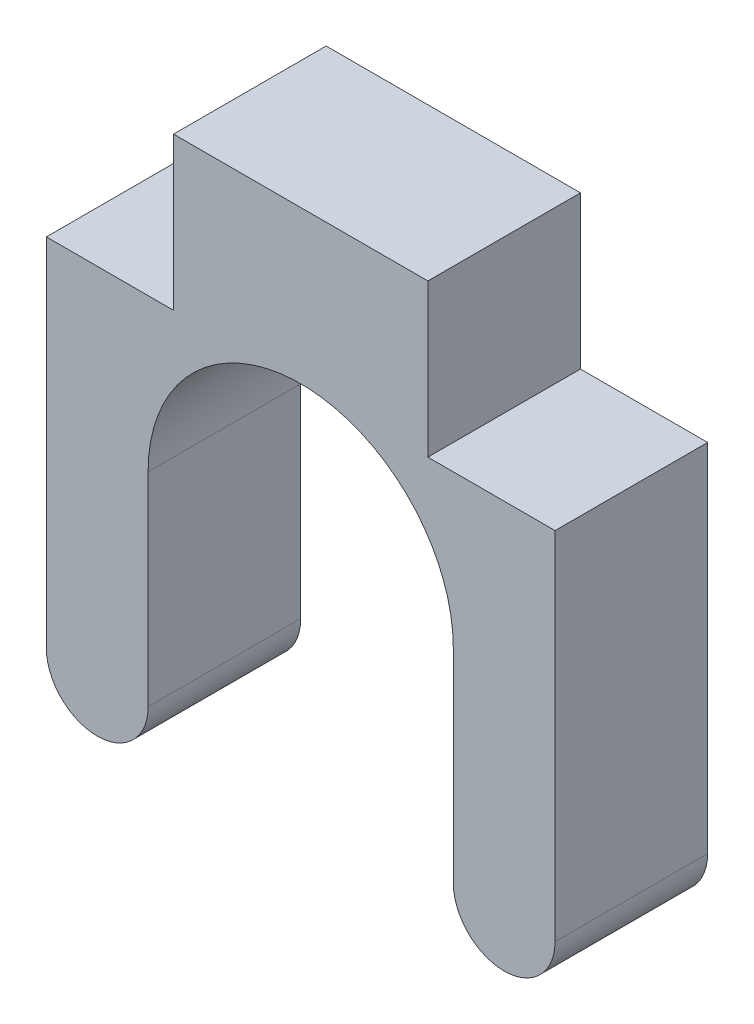
ISO-10303-21;
HEADER;
FILE_DESCRIPTION(('STEP AP214'),'2;1');
FILE_NAME('part.step','',(''),(''),'','','');
FILE_SCHEMA(('AUTOMOTIVE_DESIGN { 1 0 10303 214 1 1 1 1 }'));
ENDSEC;
DATA;
#1=APPLICATION_CONTEXT('core data for automotive mechanical design processes');
#2=APPLICATION_PROTOCOL_DEFINITION('international standard','automotive_design',2000,#1);
#3=PRODUCT_CONTEXT('',#1,'mechanical');
#4=PRODUCT('Part','Part','',(#3));
#5=PRODUCT_RELATED_PRODUCT_CATEGORY('part','',(#4));
#6=PRODUCT_DEFINITION_FORMATION('','',#4);
#7=PRODUCT_DEFINITION_CONTEXT('part definition',#1,'design');
#8=PRODUCT_DEFINITION('design','',#6,#7);
#9=PRODUCT_DEFINITION_SHAPE('','',#8);
#10=(LENGTH_UNIT() NAMED_UNIT(*) SI_UNIT(.MILLI.,.METRE.));
#11=(NAMED_UNIT(*) PLANE_ANGLE_UNIT() SI_UNIT($,.RADIAN.));
#12=(NAMED_UNIT(*) SI_UNIT($,.STERADIAN.) SOLID_ANGLE_UNIT());
#13=UNCERTAINTY_MEASURE_WITH_UNIT(LENGTH_MEASURE(1.E-05),#10,'distance_accuracy_value','');
#14=(GEOMETRIC_REPRESENTATION_CONTEXT(3) GLOBAL_UNCERTAINTY_ASSIGNED_CONTEXT((#13)) GLOBAL_UNIT_ASSIGNED_CONTEXT((#10,
#11,#12)) REPRESENTATION_CONTEXT('',''));
#15=CARTESIAN_POINT('',(0.,0.,0.));
#16=DIRECTION('',(0.,0.,1.));
#17=DIRECTION('',(1.,0.,0.));
#18=AXIS2_PLACEMENT_3D('',#15,#16,#17);
#19=CARTESIAN_POINT('',(0.,15.,0.));
#20=DIRECTION('',(0.,1.,0.));
#21=DIRECTION('',(0.,0.,1.));
#22=AXIS2_PLACEMENT_3D('',#19,#20,#21);
#23=PLANE('',#22);
#24=DIRECTION('',(-1.,0.,0.));
#25=VECTOR('',#24,1.);
#26=CARTESIAN_POINT('',(-450.,15.,-300.));
#27=LINE('',#26,#25);
#28=CARTESIAN_POINT('',(-412.5,15.,-300.));
#29=VERTEX_POINT('',#28);
#30=CARTESIAN_POINT('',(-437.5,15.,-300.));
#31=VERTEX_POINT('',#30);
#32=EDGE_CURVE('E216',#29,#31,#27,.T.);
#33=ORIENTED_EDGE('',*,*,#32,.T.);
#34=DIRECTION('',(0.,0.,1.));
#35=VECTOR('',#34,1.);
#36=CARTESIAN_POINT('',(-437.5,15.,-300.));
#37=LINE('',#36,#35);
#38=CARTESIAN_POINT('',(-437.5,15.,-285.));
#39=VERTEX_POINT('',#38);
#40=EDGE_CURVE('E198',#31,#39,#37,.T.);
#41=ORIENTED_EDGE('',*,*,#40,.T.);
#42=DIRECTION('',(-1.,0.,0.));
#43=VECTOR('',#42,1.);
#44=CARTESIAN_POINT('',(0.,15.,-285.));
#45=LINE('',#44,#43);
#46=CARTESIAN_POINT('',(-412.5,15.,-285.));
#47=VERTEX_POINT('',#46);
#48=EDGE_CURVE('E265',#47,#39,#45,.T.);
#49=ORIENTED_EDGE('',*,*,#48,.F.);
#50=DIRECTION('',(0.,0.,1.));
#51=VECTOR('',#50,1.);
#52=CARTESIAN_POINT('',(-412.5,15.,-300.));
#53=LINE('',#52,#51);
#54=EDGE_CURVE('E120',#29,#47,#53,.T.);
#55=ORIENTED_EDGE('',*,*,#54,.F.);
#56=EDGE_LOOP('',(#33,#41,#49,#55));
#57=FACE_BOUND('',#56,.T.);
#58=ADVANCED_FACE('F95',(#57),#23,.T.);
#59=CARTESIAN_POINT('',(-400.,5.55111512312578E-13,347.169905660283));
#60=DIRECTION('',(-1.,0.,0.));
#61=DIRECTION('',(0.,-1.,0.));
#62=AXIS2_PLACEMENT_3D('',#59,#60,#61);
#63=PLANE('',#62);
#64=DIRECTION('',(0.,0.,1.));
#65=VECTOR('',#64,1.);
#66=CARTESIAN_POINT('',(-400.,0.,-300.));
#67=LINE('',#66,#65);
#68=CARTESIAN_POINT('',(-400.,0.,-300.));
#69=VERTEX_POINT('',#68);
#70=CARTESIAN_POINT('',(-400.,0.,-285.));
#71=VERTEX_POINT('',#70);
#72=EDGE_CURVE('E319',#69,#71,#67,.T.);
#73=ORIENTED_EDGE('',*,*,#72,.T.);
#74=DIRECTION('',(0.,-1.,0.));
#75=VECTOR('',#74,1.);
#76=CARTESIAN_POINT('',(-400.,5.55111512312578E-13,-285.));
#77=LINE('',#76,#75);
#78=CARTESIAN_POINT('',(-400.,-35.,-285.));
#79=VERTEX_POINT('',#78);
#80=EDGE_CURVE('E283',#71,#79,#77,.T.);
#81=ORIENTED_EDGE('',*,*,#80,.T.);
#82=DIRECTION('',(0.,0.,-1.));
#83=VECTOR('',#82,1.);
#84=CARTESIAN_POINT('',(-400.,-35.,347.169905660283));
#85=LINE('',#84,#83);
#86=CARTESIAN_POINT('',(-400.,-35.,-300.));
#87=VERTEX_POINT('',#86);
#88=EDGE_CURVE('E247',#79,#87,#85,.T.);
#89=ORIENTED_EDGE('',*,*,#88,.T.);
#90=DIRECTION('',(0.,-1.,0.));
#91=VECTOR('',#90,1.);
#92=CARTESIAN_POINT('',(-400.,15.,-300.));
#93=LINE('',#92,#91);
#94=EDGE_CURVE('E223',#69,#87,#93,.T.);
#95=ORIENTED_EDGE('',*,*,#94,.F.);
#96=EDGE_LOOP('',(#73,#81,#89,#95));
#97=FACE_BOUND('',#96,.T.);
#98=ADVANCED_FACE('F343',(#97),#63,.F.);
#99=CARTESIAN_POINT('',(-450.,15.,-300.));
#100=DIRECTION('',(0.,0.,1.));
#101=DIRECTION('',(1.,0.,0.));
#102=AXIS2_PLACEMENT_3D('',#99,#100,#101);
#103=PLANE('',#102);
#104=DIRECTION('',(0.,-1.,0.));
#105=VECTOR('',#104,1.);
#106=CARTESIAN_POINT('',(-437.5,0.,-300.));
#107=LINE('',#106,#105);
#108=CARTESIAN_POINT('',(-437.5,0.,-300.));
#109=VERTEX_POINT('',#108);
#110=EDGE_CURVE('E201',#31,#109,#107,.T.);
#111=ORIENTED_EDGE('',*,*,#110,.F.);
#112=ORIENTED_EDGE('',*,*,#32,.F.);
#113=DIRECTION('',(0.,-1.,0.));
#114=VECTOR('',#113,1.);
#115=CARTESIAN_POINT('',(-412.5,0.,-300.));
#116=LINE('',#115,#114);
#117=CARTESIAN_POINT('',(-412.5,0.,-300.));
#118=VERTEX_POINT('',#117);
#119=EDGE_CURVE('E324',#29,#118,#116,.T.);
#120=ORIENTED_EDGE('',*,*,#119,.T.);
#121=DIRECTION('',(-1.,0.,0.));
#122=VECTOR('',#121,1.);
#123=CARTESIAN_POINT('',(0.,0.,-300.));
#124=LINE('',#123,#122);
#125=EDGE_CURVE('E326',#69,#118,#124,.T.);
#126=ORIENTED_EDGE('',*,*,#125,.F.);
#127=ORIENTED_EDGE('',*,*,#94,.T.);
#128=CARTESIAN_POINT('',(-405.,-35.,-300.));
#129=DIRECTION('',(0.,0.,1.));
#130=DIRECTION('',(1.,0.,0.));
#131=AXIS2_PLACEMENT_3D('',#128,#129,#130);
#132=CIRCLE('',#131,5.);
#133=CARTESIAN_POINT('',(-405.,-40.,-300.));
#134=VERTEX_POINT('',#133);
#135=EDGE_CURVE('E236',#87,#134,#132,.F.);
#136=ORIENTED_EDGE('',*,*,#135,.T.);
#137=CARTESIAN_POINT('',(-405.,-35.,-300.));
#138=DIRECTION('',(0.,0.,1.));
#139=DIRECTION('',(1.,0.,0.));
#140=AXIS2_PLACEMENT_3D('',#137,#138,#139);
#141=CIRCLE('',#140,5.);
#142=CARTESIAN_POINT('',(-410.,-35.,-300.));
#143=VERTEX_POINT('',#142);
#144=EDGE_CURVE('E234',#134,#143,#141,.F.);
#145=ORIENTED_EDGE('',*,*,#144,.T.);
#146=DIRECTION('',(0.,1.,0.));
#147=VECTOR('',#146,1.);
#148=CARTESIAN_POINT('',(-410.,0.,-300.));
#149=LINE('',#148,#147);
#150=CARTESIAN_POINT('',(-410.,-15.,-300.));
#151=VERTEX_POINT('',#150);
#152=EDGE_CURVE('E226',#143,#151,#149,.T.);
#153=ORIENTED_EDGE('',*,*,#152,.T.);
#154=CARTESIAN_POINT('',(-425.,-15.,-300.));
#155=DIRECTION('',(0.,0.,1.));
#156=DIRECTION('',(1.,0.,0.));
#157=AXIS2_PLACEMENT_3D('',#154,#155,#156);
#158=CIRCLE('',#157,15.);
#159=CARTESIAN_POINT('',(-440.,-15.,-300.));
#160=VERTEX_POINT('',#159);
#161=EDGE_CURVE('E290',#160,#151,#158,.F.);
#162=ORIENTED_EDGE('',*,*,#161,.F.);
#163=DIRECTION('',(0.,1.,0.));
#164=VECTOR('',#163,1.);
#165=CARTESIAN_POINT('',(-440.,0.,-300.));
#166=LINE('',#165,#164);
#167=CARTESIAN_POINT('',(-440.,-35.,-300.));
#168=VERTEX_POINT('',#167);
#169=EDGE_CURVE('E288',#168,#160,#166,.T.);
#170=ORIENTED_EDGE('',*,*,#169,.F.);
#171=CARTESIAN_POINT('',(-445.,-35.,-300.));
#172=DIRECTION('',(0.,0.,1.));
#173=DIRECTION('',(1.,0.,0.));
#174=AXIS2_PLACEMENT_3D('',#171,#172,#173);
#175=CIRCLE('',#174,5.);
#176=CARTESIAN_POINT('',(-445.,-40.,-300.));
#177=VERTEX_POINT('',#176);
#178=EDGE_CURVE('E241',#168,#177,#175,.F.);
#179=ORIENTED_EDGE('',*,*,#178,.T.);
#180=CARTESIAN_POINT('',(-445.,-35.,-300.));
#181=DIRECTION('',(0.,0.,1.));
#182=DIRECTION('',(1.,0.,0.));
#183=AXIS2_PLACEMENT_3D('',#180,#181,#182);
#184=CIRCLE('',#183,5.);
#185=CARTESIAN_POINT('',(-450.,-35.,-300.));
#186=VERTEX_POINT('',#185);
#187=EDGE_CURVE('E238',#177,#186,#184,.F.);
#188=ORIENTED_EDGE('',*,*,#187,.T.);
#189=DIRECTION('',(0.,-1.,0.));
#190=VECTOR('',#189,1.);
#191=CARTESIAN_POINT('',(-450.,15.,-300.));
#192=LINE('',#191,#190);
#193=CARTESIAN_POINT('',(-450.,0.,-300.));
#194=VERTEX_POINT('',#193);
#195=EDGE_CURVE('E220',#194,#186,#192,.T.);
#196=ORIENTED_EDGE('',*,*,#195,.F.);
#197=DIRECTION('',(1.,0.,0.));
#198=VECTOR('',#197,1.);
#199=CARTESIAN_POINT('',(0.,0.,-300.));
#200=LINE('',#199,#198);
#201=EDGE_CURVE('E209',#194,#109,#200,.T.);
#202=ORIENTED_EDGE('',*,*,#201,.T.);
#203=EDGE_LOOP('',(#111,#112,#120,#126,#127,#136,#145,#153,#162,#170,#179,#188,#196,#202));
#204=FACE_BOUND('',#203,.T.);
#205=ADVANCED_FACE('F214',(#204),#103,.F.);
#206=CARTESIAN_POINT('',(-450.,0.,-285.));
#207=DIRECTION('',(0.,0.,-1.));
#208=DIRECTION('',(-1.,0.,0.));
#209=AXIS2_PLACEMENT_3D('',#206,#207,#208);
#210=PLANE('',#209);
#211=DIRECTION('',(0.,-1.,0.));
#212=VECTOR('',#211,1.);
#213=CARTESIAN_POINT('',(-437.5,0.,-285.));
#214=LINE('',#213,#212);
#215=CARTESIAN_POINT('',(-437.5,0.,-285.));
#216=VERTEX_POINT('',#215);
#217=EDGE_CURVE('E204',#39,#216,#214,.T.);
#218=ORIENTED_EDGE('',*,*,#217,.T.);
#219=DIRECTION('',(1.,0.,0.));
#220=VECTOR('',#219,1.);
#221=CARTESIAN_POINT('',(0.,0.,-285.));
#222=LINE('',#221,#220);
#223=CARTESIAN_POINT('',(-450.,0.,-285.));
#224=VERTEX_POINT('',#223);
#225=EDGE_CURVE('E218',#224,#216,#222,.T.);
#226=ORIENTED_EDGE('',*,*,#225,.F.);
#227=DIRECTION('',(0.,1.,0.));
#228=VECTOR('',#227,1.);
#229=CARTESIAN_POINT('',(-450.,0.,-285.));
#230=LINE('',#229,#228);
#231=CARTESIAN_POINT('',(-450.,-35.,-285.));
#232=VERTEX_POINT('',#231);
#233=EDGE_CURVE('E257',#232,#224,#230,.T.);
#234=ORIENTED_EDGE('',*,*,#233,.F.);
#235=CARTESIAN_POINT('',(-445.,-35.,-285.));
#236=DIRECTION('',(0.,0.,-1.));
#237=DIRECTION('',(-1.,0.,0.));
#238=AXIS2_PLACEMENT_3D('',#235,#236,#237);
#239=CIRCLE('',#238,5.);
#240=CARTESIAN_POINT('',(-445.,-40.,-285.));
#241=VERTEX_POINT('',#240);
#242=EDGE_CURVE('E243',#232,#241,#239,.F.);
#243=ORIENTED_EDGE('',*,*,#242,.T.);
#244=CARTESIAN_POINT('',(-445.,-35.,-285.));
#245=DIRECTION('',(0.,0.,-1.));
#246=DIRECTION('',(-1.,0.,0.));
#247=AXIS2_PLACEMENT_3D('',#244,#245,#246);
#248=CIRCLE('',#247,5.);
#249=CARTESIAN_POINT('',(-440.,-35.,-285.));
#250=VERTEX_POINT('',#249);
#251=EDGE_CURVE('E245',#241,#250,#248,.F.);
#252=ORIENTED_EDGE('',*,*,#251,.T.);
#253=DIRECTION('',(0.,1.,0.));
#254=VECTOR('',#253,1.);
#255=CARTESIAN_POINT('',(-440.,0.,-285.));
#256=LINE('',#255,#254);
#257=CARTESIAN_POINT('',(-440.,-15.,-285.));
#258=VERTEX_POINT('',#257);
#259=EDGE_CURVE('E262',#250,#258,#256,.T.);
#260=ORIENTED_EDGE('',*,*,#259,.T.);
#261=CARTESIAN_POINT('',(-425.,-15.,-285.));
#262=DIRECTION('',(0.,0.,-1.));
#263=DIRECTION('',(-1.,0.,0.));
#264=AXIS2_PLACEMENT_3D('',#261,#262,#263);
#265=CIRCLE('',#264,15.);
#266=CARTESIAN_POINT('',(-410.,-15.,-285.));
#267=VERTEX_POINT('',#266);
#268=EDGE_CURVE('E278',#258,#267,#265,.T.);
#269=ORIENTED_EDGE('',*,*,#268,.T.);
#270=DIRECTION('',(0.,1.,0.));
#271=VECTOR('',#270,1.);
#272=CARTESIAN_POINT('',(-410.,0.,-285.));
#273=LINE('',#272,#271);
#274=CARTESIAN_POINT('',(-410.,-35.,-285.));
#275=VERTEX_POINT('',#274);
#276=EDGE_CURVE('E280',#275,#267,#273,.T.);
#277=ORIENTED_EDGE('',*,*,#276,.F.);
#278=CARTESIAN_POINT('',(-405.,-35.,-285.));
#279=DIRECTION('',(0.,0.,-1.));
#280=DIRECTION('',(-1.,0.,0.));
#281=AXIS2_PLACEMENT_3D('',#278,#279,#280);
#282=CIRCLE('',#281,5.);
#283=CARTESIAN_POINT('',(-405.,-40.,-285.));
#284=VERTEX_POINT('',#283);
#285=EDGE_CURVE('E250',#275,#284,#282,.F.);
#286=ORIENTED_EDGE('',*,*,#285,.T.);
#287=CARTESIAN_POINT('',(-405.,-35.,-285.));
#288=DIRECTION('',(0.,0.,-1.));
#289=DIRECTION('',(-1.,0.,0.));
#290=AXIS2_PLACEMENT_3D('',#287,#288,#289);
#291=CIRCLE('',#290,5.);
#292=EDGE_CURVE('E252',#284,#79,#291,.F.);
#293=ORIENTED_EDGE('',*,*,#292,.T.);
#294=ORIENTED_EDGE('',*,*,#80,.F.);
#295=DIRECTION('',(-1.,0.,0.));
#296=VECTOR('',#295,1.);
#297=CARTESIAN_POINT('',(0.,0.,-285.));
#298=LINE('',#297,#296);
#299=CARTESIAN_POINT('',(-412.5,0.,-285.));
#300=VERTEX_POINT('',#299);
#301=EDGE_CURVE('E327',#71,#300,#298,.T.);
#302=ORIENTED_EDGE('',*,*,#301,.T.);
#303=DIRECTION('',(0.,-1.,0.));
#304=VECTOR('',#303,1.);
#305=CARTESIAN_POINT('',(-412.5,0.,-285.));
#306=LINE('',#305,#304);
#307=EDGE_CURVE('E329',#47,#300,#306,.T.);
#308=ORIENTED_EDGE('',*,*,#307,.F.);
#309=ORIENTED_EDGE('',*,*,#48,.T.);
#310=EDGE_LOOP('',(#218,#226,#234,#243,#252,#260,#269,#277,#286,#293,#294,#302,#308,#309));
#311=FACE_BOUND('',#310,.T.);
#312=ADVANCED_FACE('F317',(#311),#210,.F.);
#313=CARTESIAN_POINT('',(-450.,15.,-300.));
#314=DIRECTION('',(1.,0.,0.));
#315=DIRECTION('',(0.,0.,-1.));
#316=AXIS2_PLACEMENT_3D('',#313,#314,#315);
#317=PLANE('',#316);
#318=ORIENTED_EDGE('',*,*,#233,.T.);
#319=DIRECTION('',(0.,0.,1.));
#320=VECTOR('',#319,1.);
#321=CARTESIAN_POINT('',(-450.,0.,-300.));
#322=LINE('',#321,#320);
#323=EDGE_CURVE('E112',#194,#224,#322,.T.);
#324=ORIENTED_EDGE('',*,*,#323,.F.);
#325=ORIENTED_EDGE('',*,*,#195,.T.);
#326=DIRECTION('',(0.,0.,-1.));
#327=VECTOR('',#326,1.);
#328=CARTESIAN_POINT('',(-450.,-35.,-300.));
#329=LINE('',#328,#327);
#330=EDGE_CURVE('E104',#186,#232,#329,.F.);
#331=ORIENTED_EDGE('',*,*,#330,.T.);
#332=EDGE_LOOP('',(#318,#324,#325,#331));
#333=FACE_BOUND('',#332,.T.);
#334=ADVANCED_FACE('F316',(#333),#317,.F.);
#335=CARTESIAN_POINT('',(-410.,0.,347.169905660283));
#336=DIRECTION('',(1.,0.,0.));
#337=DIRECTION('',(0.,0.,-1.));
#338=AXIS2_PLACEMENT_3D('',#335,#336,#337);
#339=PLANE('',#338);
#340=ORIENTED_EDGE('',*,*,#152,.F.);
#341=DIRECTION('',(0.,0.,-1.));
#342=VECTOR('',#341,1.);
#343=CARTESIAN_POINT('',(-410.,-35.,347.169905660283));
#344=LINE('',#343,#342);
#345=EDGE_CURVE('E12',#143,#275,#344,.F.);
#346=ORIENTED_EDGE('',*,*,#345,.T.);
#347=ORIENTED_EDGE('',*,*,#276,.T.);
#348=DIRECTION('',(0.,0.,-1.));
#349=VECTOR('',#348,1.);
#350=CARTESIAN_POINT('',(-410.,-15.,347.169905660283));
#351=LINE('',#350,#349);
#352=EDGE_CURVE('E221',#267,#151,#351,.T.);
#353=ORIENTED_EDGE('',*,*,#352,.T.);
#354=EDGE_LOOP('',(#340,#346,#347,#353));
#355=FACE_BOUND('',#354,.T.);
#356=ADVANCED_FACE('F299',(#355),#339,.F.);
#357=CARTESIAN_POINT('',(-425.,-15.,347.169905660283));
#358=DIRECTION('',(0.,0.,-1.));
#359=DIRECTION('',(-1.,0.,0.));
#360=AXIS2_PLACEMENT_3D('',#357,#358,#359);
#361=CYLINDRICAL_SURFACE('',#360,15.);
#362=ORIENTED_EDGE('',*,*,#352,.F.);
#363=ORIENTED_EDGE('',*,*,#268,.F.);
#364=DIRECTION('',(0.,0.,-1.));
#365=VECTOR('',#364,1.);
#366=CARTESIAN_POINT('',(-440.,-15.,347.169905660283));
#367=LINE('',#366,#365);
#368=EDGE_CURVE('E285',#258,#160,#367,.T.);
#369=ORIENTED_EDGE('',*,*,#368,.T.);
#370=ORIENTED_EDGE('',*,*,#161,.T.);
#371=EDGE_LOOP('',(#362,#363,#369,#370));
#372=FACE_BOUND('',#371,.T.);
#373=ADVANCED_FACE('F303',(#372),#361,.F.);
#374=CARTESIAN_POINT('',(-440.,0.,347.169905660283));
#375=DIRECTION('',(1.,0.,0.));
#376=DIRECTION('',(0.,0.,-1.));
#377=AXIS2_PLACEMENT_3D('',#374,#375,#376);
#378=PLANE('',#377);
#379=ORIENTED_EDGE('',*,*,#259,.F.);
#380=DIRECTION('',(0.,0.,-1.));
#381=VECTOR('',#380,1.);
#382=CARTESIAN_POINT('',(-440.,-35.,-300.));
#383=LINE('',#382,#381);
#384=EDGE_CURVE('E231',#250,#168,#383,.T.);
#385=ORIENTED_EDGE('',*,*,#384,.T.);
#386=ORIENTED_EDGE('',*,*,#169,.T.);
#387=ORIENTED_EDGE('',*,*,#368,.F.);
#388=EDGE_LOOP('',(#379,#385,#386,#387));
#389=FACE_BOUND('',#388,.T.);
#390=ADVANCED_FACE('F307',(#389),#378,.T.);
#391=CARTESIAN_POINT('',(-445.,-35.,347.169905660283));
#392=DIRECTION('',(0.,0.,-1.));
#393=DIRECTION('',(-1.,0.,0.));
#394=AXIS2_PLACEMENT_3D('',#391,#392,#393);
#395=CYLINDRICAL_SURFACE('',#394,5.);
#396=DIRECTION('',(0.,0.,-1.));
#397=VECTOR('',#396,1.);
#398=CARTESIAN_POINT('',(-445.,-40.,347.169905660283));
#399=LINE('',#398,#397);
#400=EDGE_CURVE('E255',#241,#177,#399,.T.);
#401=ORIENTED_EDGE('',*,*,#400,.F.);
#402=ORIENTED_EDGE('',*,*,#242,.F.);
#403=ORIENTED_EDGE('',*,*,#330,.F.);
#404=ORIENTED_EDGE('',*,*,#187,.F.);
#405=EDGE_LOOP('',(#401,#402,#403,#404));
#406=FACE_BOUND('',#405,.T.);
#407=ADVANCED_FACE('F312',(#406),#395,.T.);
#408=CARTESIAN_POINT('',(-445.,-35.,347.169905660283));
#409=DIRECTION('',(0.,0.,1.));
#410=DIRECTION('',(1.,0.,0.));
#411=AXIS2_PLACEMENT_3D('',#408,#409,#410);
#412=CYLINDRICAL_SURFACE('',#411,5.);
#413=ORIENTED_EDGE('',*,*,#251,.F.);
#414=ORIENTED_EDGE('',*,*,#400,.T.);
#415=ORIENTED_EDGE('',*,*,#178,.F.);
#416=ORIENTED_EDGE('',*,*,#384,.F.);
#417=EDGE_LOOP('',(#413,#414,#415,#416));
#418=FACE_BOUND('',#417,.T.);
#419=ADVANCED_FACE('F353',(#418),#412,.T.);
#420=CARTESIAN_POINT('',(-405.,-35.,347.169905660283));
#421=DIRECTION('',(0.,0.,-1.));
#422=DIRECTION('',(-1.,0.,0.));
#423=AXIS2_PLACEMENT_3D('',#420,#421,#422);
#424=CYLINDRICAL_SURFACE('',#423,5.);
#425=DIRECTION('',(0.,0.,-1.));
#426=VECTOR('',#425,1.);
#427=CARTESIAN_POINT('',(-405.,-40.,347.169905660283));
#428=LINE('',#427,#426);
#429=EDGE_CURVE('E99',#284,#134,#428,.T.);
#430=ORIENTED_EDGE('',*,*,#429,.F.);
#431=ORIENTED_EDGE('',*,*,#285,.F.);
#432=ORIENTED_EDGE('',*,*,#345,.F.);
#433=ORIENTED_EDGE('',*,*,#144,.F.);
#434=EDGE_LOOP('',(#430,#431,#432,#433));
#435=FACE_BOUND('',#434,.T.);
#436=ADVANCED_FACE('F97',(#435),#424,.T.);
#437=CARTESIAN_POINT('',(-405.,-35.,347.169905660283));
#438=DIRECTION('',(0.,0.,-1.));
#439=DIRECTION('',(-1.,0.,0.));
#440=AXIS2_PLACEMENT_3D('',#437,#438,#439);
#441=CYLINDRICAL_SURFACE('',#440,5.);
#442=ORIENTED_EDGE('',*,*,#292,.F.);
#443=ORIENTED_EDGE('',*,*,#429,.T.);
#444=ORIENTED_EDGE('',*,*,#135,.F.);
#445=ORIENTED_EDGE('',*,*,#88,.F.);
#446=EDGE_LOOP('',(#442,#443,#444,#445));
#447=FACE_BOUND('',#446,.T.);
#448=ADVANCED_FACE('F345',(#447),#441,.T.);
#449=CARTESIAN_POINT('',(0.,0.,-300.));
#450=DIRECTION('',(0.,1.,0.));
#451=DIRECTION('',(0.,0.,1.));
#452=AXIS2_PLACEMENT_3D('',#449,#450,#451);
#453=PLANE('',#452);
#454=ORIENTED_EDGE('',*,*,#301,.F.);
#455=ORIENTED_EDGE('',*,*,#72,.F.);
#456=ORIENTED_EDGE('',*,*,#125,.T.);
#457=DIRECTION('',(0.,0.,1.));
#458=VECTOR('',#457,1.);
#459=CARTESIAN_POINT('',(-412.5,0.,-300.));
#460=LINE('',#459,#458);
#461=EDGE_CURVE('E334',#118,#300,#460,.T.);
#462=ORIENTED_EDGE('',*,*,#461,.T.);
#463=EDGE_LOOP('',(#454,#455,#456,#462));
#464=FACE_BOUND('',#463,.T.);
#465=ADVANCED_FACE('F337',(#464),#453,.T.);
#466=CARTESIAN_POINT('',(-412.5,0.,-300.));
#467=DIRECTION('',(-1.,0.,0.));
#468=DIRECTION('',(0.,0.,1.));
#469=AXIS2_PLACEMENT_3D('',#466,#467,#468);
#470=PLANE('',#469);
#471=ORIENTED_EDGE('',*,*,#307,.T.);
#472=ORIENTED_EDGE('',*,*,#461,.F.);
#473=ORIENTED_EDGE('',*,*,#119,.F.);
#474=ORIENTED_EDGE('',*,*,#54,.T.);
#475=EDGE_LOOP('',(#471,#472,#473,#474));
#476=FACE_BOUND('',#475,.T.);
#477=ADVANCED_FACE('F339',(#476),#470,.F.);
#478=CARTESIAN_POINT('',(-437.5,0.,-300.));
#479=DIRECTION('',(-1.,0.,0.));
#480=DIRECTION('',(0.,0.,1.));
#481=AXIS2_PLACEMENT_3D('',#478,#479,#480);
#482=PLANE('',#481);
#483=ORIENTED_EDGE('',*,*,#217,.F.);
#484=ORIENTED_EDGE('',*,*,#40,.F.);
#485=ORIENTED_EDGE('',*,*,#110,.T.);
#486=DIRECTION('',(0.,0.,1.));
#487=VECTOR('',#486,1.);
#488=CARTESIAN_POINT('',(-437.5,0.,-300.));
#489=LINE('',#488,#487);
#490=EDGE_CURVE('E270',#109,#216,#489,.T.);
#491=ORIENTED_EDGE('',*,*,#490,.T.);
#492=EDGE_LOOP('',(#483,#484,#485,#491));
#493=FACE_BOUND('',#492,.T.);
#494=ADVANCED_FACE('F200',(#493),#482,.T.);
#495=CARTESIAN_POINT('',(0.,0.,-300.));
#496=DIRECTION('',(0.,-1.,0.));
#497=DIRECTION('',(0.,0.,-1.));
#498=AXIS2_PLACEMENT_3D('',#495,#496,#497);
#499=PLANE('',#498);
#500=ORIENTED_EDGE('',*,*,#225,.T.);
#501=ORIENTED_EDGE('',*,*,#490,.F.);
#502=ORIENTED_EDGE('',*,*,#201,.F.);
#503=ORIENTED_EDGE('',*,*,#323,.T.);
#504=EDGE_LOOP('',(#500,#501,#502,#503));
#505=FACE_BOUND('',#504,.T.);
#506=ADVANCED_FACE('F479',(#505),#499,.F.);
#507=CLOSED_SHELL('',(#58,#98,#205,#312,#334,#356,#373,#390,#407,#419,#436,#448,#465,#477,#494,#506));
#508=MANIFOLD_SOLID_BREP('B2',#507);
#509=ADVANCED_BREP_SHAPE_REPRESENTATION('',(#18,#508),#14);
#510=SHAPE_DEFINITION_REPRESENTATION(#9,#509);
ENDSEC;
END-ISO-10303-21;
